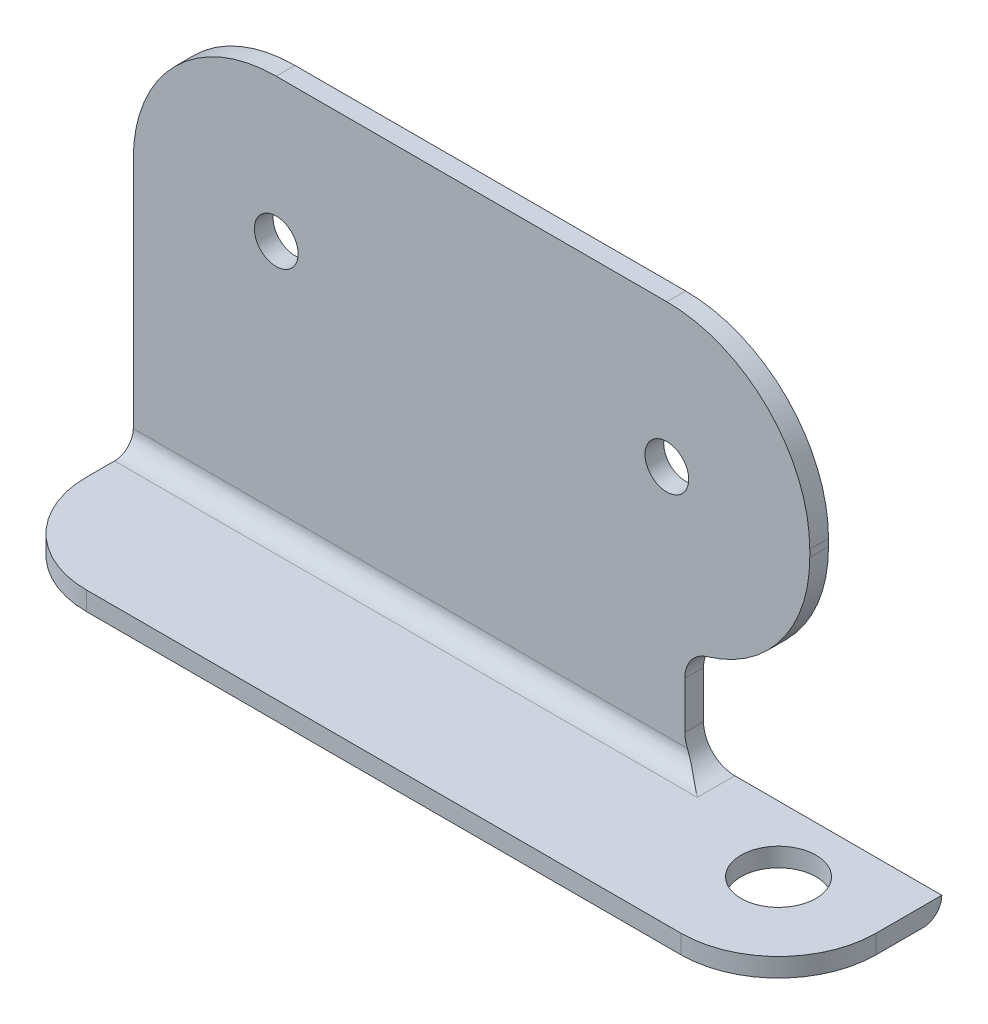
ISO-10303-21;
HEADER;
FILE_DESCRIPTION(('STEP AP214'),'2;1');
FILE_NAME('part.step','',(''),(''),'','','');
FILE_SCHEMA(('AUTOMOTIVE_DESIGN { 1 0 10303 214 1 1 1 1 }'));
ENDSEC;
DATA;
#1=APPLICATION_CONTEXT('core data for automotive mechanical design processes');
#2=APPLICATION_PROTOCOL_DEFINITION('international standard','automotive_design',2000,#1);
#3=PRODUCT_CONTEXT('',#1,'mechanical');
#4=PRODUCT('Part','Part','',(#3));
#5=PRODUCT_RELATED_PRODUCT_CATEGORY('part','',(#4));
#6=PRODUCT_DEFINITION_FORMATION('','',#4);
#7=PRODUCT_DEFINITION_CONTEXT('part definition',#1,'design');
#8=PRODUCT_DEFINITION('design','',#6,#7);
#9=PRODUCT_DEFINITION_SHAPE('','',#8);
#10=(LENGTH_UNIT() NAMED_UNIT(*) SI_UNIT(.MILLI.,.METRE.));
#11=(NAMED_UNIT(*) PLANE_ANGLE_UNIT() SI_UNIT($,.RADIAN.));
#12=(NAMED_UNIT(*) SI_UNIT($,.STERADIAN.) SOLID_ANGLE_UNIT());
#13=UNCERTAINTY_MEASURE_WITH_UNIT(LENGTH_MEASURE(1.E-05),#10,'distance_accuracy_value','');
#14=(GEOMETRIC_REPRESENTATION_CONTEXT(3) GLOBAL_UNCERTAINTY_ASSIGNED_CONTEXT((#13)) GLOBAL_UNIT_ASSIGNED_CONTEXT((#10,
#11,#12)) REPRESENTATION_CONTEXT('',''));
#15=CARTESIAN_POINT('',(0.,0.,0.));
#16=DIRECTION('',(0.,0.,1.));
#17=DIRECTION('',(1.,0.,0.));
#18=AXIS2_PLACEMENT_3D('',#15,#16,#17);
#19=CARTESIAN_POINT('',(0.,0.,1.524));
#20=DIRECTION('',(0.,0.,1.));
#21=DIRECTION('',(1.,0.,0.));
#22=AXIS2_PLACEMENT_3D('',#19,#20,#21);
#23=PLANE('',#22);
#24=CARTESIAN_POINT('',(15.875,0.,1.524));
#25=DIRECTION('',(0.,0.,-1.));
#26=DIRECTION('',(1.,0.,0.));
#27=AXIS2_PLACEMENT_3D('',#24,#25,#26);
#28=CIRCLE('',#27,1.778);
#29=CARTESIAN_POINT('',(14.097,0.,1.524));
#30=VERTEX_POINT('',#29);
#31=EDGE_CURVE('E211',#30,#30,#28,.T.);
#32=ORIENTED_EDGE('',*,*,#31,.T.);
#33=EDGE_LOOP('',(#32));
#34=FACE_BOUND('',#33,.T.);
#35=CARTESIAN_POINT('',(-15.875,0.,1.524));
#36=DIRECTION('',(0.,0.,-1.));
#37=DIRECTION('',(1.,0.,0.));
#38=AXIS2_PLACEMENT_3D('',#35,#36,#37);
#39=CIRCLE('',#38,1.778);
#40=CARTESIAN_POINT('',(-17.653,0.,1.524));
#41=VERTEX_POINT('',#40);
#42=EDGE_CURVE('E205',#41,#41,#39,.T.);
#43=ORIENTED_EDGE('',*,*,#42,.T.);
#44=EDGE_LOOP('',(#43));
#45=FACE_BOUND('',#44,.T.);
#46=CARTESIAN_POINT('',(19.8755,-17.9705,1.524));
#47=DIRECTION('',(0.,0.,-1.));
#48=DIRECTION('',(1.,0.,0.));
#49=AXIS2_PLACEMENT_3D('',#46,#47,#48);
#50=CIRCLE('',#49,2.54);
#51=CARTESIAN_POINT('',(17.5475515469624,-18.9865,1.524));
#52=VERTEX_POINT('',#51);
#53=CARTESIAN_POINT('',(17.3355,-17.9705,1.524));
#54=VERTEX_POINT('',#53);
#55=EDGE_CURVE('E185',#52,#54,#50,.T.);
#56=ORIENTED_EDGE('',*,*,#55,.T.);
#57=DIRECTION('',(0.,1.,0.));
#58=VECTOR('',#57,1.);
#59=CARTESIAN_POINT('',(17.3355,0.,1.524));
#60=LINE('',#59,#58);
#61=CARTESIAN_POINT('',(17.3355,-14.1605,1.524));
#62=VERTEX_POINT('',#61);
#63=EDGE_CURVE('E190',#54,#62,#60,.T.);
#64=ORIENTED_EDGE('',*,*,#63,.T.);
#65=CARTESIAN_POINT('',(19.8755,-14.1605,1.524));
#66=DIRECTION('',(0.,0.,-1.));
#67=DIRECTION('',(1.,0.,0.));
#68=AXIS2_PLACEMENT_3D('',#65,#66,#67);
#69=CIRCLE('',#68,2.54);
#70=CARTESIAN_POINT('',(19.1579215246637,-11.7239694478144,1.524));
#71=VERTEX_POINT('',#70);
#72=EDGE_CURVE('E155',#62,#71,#69,.T.);
#73=ORIENTED_EDGE('',*,*,#72,.T.);
#74=CARTESIAN_POINT('',(15.875,-0.576842171565131,1.524));
#75=DIRECTION('',(0.,0.,-1.));
#76=DIRECTION('',(1.,0.,0.));
#77=AXIS2_PLACEMENT_3D('',#74,#75,#76);
#78=CIRCLE('',#77,11.6205);
#79=CARTESIAN_POINT('',(27.4955,-0.576842171565131,1.524));
#80=VERTEX_POINT('',#79);
#81=EDGE_CURVE('E269',#80,#71,#78,.T.);
#82=ORIENTED_EDGE('',*,*,#81,.F.);
#83=DIRECTION('',(0.,-1.,0.));
#84=VECTOR('',#83,1.);
#85=CARTESIAN_POINT('',(27.4955,-11.6205,1.524));
#86=LINE('',#85,#84);
#87=CARTESIAN_POINT('',(27.4955,0.,1.524));
#88=VERTEX_POINT('',#87);
#89=EDGE_CURVE('E224',#88,#80,#86,.T.);
#90=ORIENTED_EDGE('',*,*,#89,.F.);
#91=CARTESIAN_POINT('',(15.875,0.,1.524));
#92=DIRECTION('',(0.,0.,-1.));
#93=DIRECTION('',(1.,0.,0.));
#94=AXIS2_PLACEMENT_3D('',#91,#92,#93);
#95=CIRCLE('',#94,11.6205);
#96=CARTESIAN_POINT('',(15.875,11.6205,1.524));
#97=VERTEX_POINT('',#96);
#98=EDGE_CURVE('E258',#97,#88,#95,.T.);
#99=ORIENTED_EDGE('',*,*,#98,.F.);
#100=DIRECTION('',(1.,0.,0.));
#101=VECTOR('',#100,1.);
#102=CARTESIAN_POINT('',(-27.4955,11.6205,1.524));
#103=LINE('',#102,#101);
#104=CARTESIAN_POINT('',(-15.875,11.6205,1.524));
#105=VERTEX_POINT('',#104);
#106=EDGE_CURVE('E220',#105,#97,#103,.T.);
#107=ORIENTED_EDGE('',*,*,#106,.F.);
#108=CARTESIAN_POINT('',(-15.875,0.,1.524));
#109=DIRECTION('',(0.,0.,-1.));
#110=DIRECTION('',(1.,0.,0.));
#111=AXIS2_PLACEMENT_3D('',#108,#109,#110);
#112=CIRCLE('',#111,11.6205);
#113=CARTESIAN_POINT('',(-27.4955,0.,1.524));
#114=VERTEX_POINT('',#113);
#115=EDGE_CURVE('E272',#114,#105,#112,.T.);
#116=ORIENTED_EDGE('',*,*,#115,.F.);
#117=DIRECTION('',(0.,1.,0.));
#118=VECTOR('',#117,1.);
#119=CARTESIAN_POINT('',(-27.4955,-22.0345,1.524));
#120=LINE('',#119,#118);
#121=CARTESIAN_POINT('',(-27.4955,-18.9865,1.524));
#122=VERTEX_POINT('',#121);
#123=EDGE_CURVE('E217',#122,#114,#120,.T.);
#124=ORIENTED_EDGE('',*,*,#123,.F.);
#125=DIRECTION('',(1.,0.,0.));
#126=VECTOR('',#125,1.);
#127=CARTESIAN_POINT('',(0.,-18.9865,1.524));
#128=LINE('',#127,#126);
#129=EDGE_CURVE('E282',#52,#122,#128,.F.);
#130=ORIENTED_EDGE('',*,*,#129,.F.);
#131=EDGE_LOOP('',(#56,#64,#73,#82,#90,#99,#107,#116,#124,#130));
#132=FACE_BOUND('',#131,.T.);
#133=ADVANCED_FACE('F35',(#34,#45,#132),#23,.T.);
#134=CARTESIAN_POINT('',(0.,0.,0.));
#135=DIRECTION('',(0.,0.,1.));
#136=DIRECTION('',(1.,0.,0.));
#137=AXIS2_PLACEMENT_3D('',#134,#135,#136);
#138=PLANE('',#137);
#139=DIRECTION('',(0.,1.,0.));
#140=VECTOR('',#139,1.);
#141=CARTESIAN_POINT('',(-27.4955,-7.42949999999999,0.));
#142=LINE('',#141,#140);
#143=CARTESIAN_POINT('',(-27.4955,-20.5105,0.));
#144=VERTEX_POINT('',#143);
#145=CARTESIAN_POINT('',(-27.4955,0.,0.));
#146=VERTEX_POINT('',#145);
#147=EDGE_CURVE('E214',#144,#146,#142,.T.);
#148=ORIENTED_EDGE('',*,*,#147,.T.);
#149=CARTESIAN_POINT('',(-15.875,0.,0.));
#150=DIRECTION('',(0.,0.,-1.));
#151=DIRECTION('',(1.,0.,0.));
#152=AXIS2_PLACEMENT_3D('',#149,#150,#151);
#153=CIRCLE('',#152,11.6205);
#154=CARTESIAN_POINT('',(-15.875,11.6205,0.));
#155=VERTEX_POINT('',#154);
#156=EDGE_CURVE('E264',#155,#146,#153,.F.);
#157=ORIENTED_EDGE('',*,*,#156,.F.);
#158=DIRECTION('',(1.,0.,0.));
#159=VECTOR('',#158,1.);
#160=CARTESIAN_POINT('',(-27.4955,11.6205,0.));
#161=LINE('',#160,#159);
#162=CARTESIAN_POINT('',(15.875,11.6205,0.));
#163=VERTEX_POINT('',#162);
#164=EDGE_CURVE('E229',#155,#163,#161,.T.);
#165=ORIENTED_EDGE('',*,*,#164,.T.);
#166=CARTESIAN_POINT('',(15.875,0.,0.));
#167=DIRECTION('',(0.,0.,-1.));
#168=DIRECTION('',(1.,0.,0.));
#169=AXIS2_PLACEMENT_3D('',#166,#167,#168);
#170=CIRCLE('',#169,11.6205);
#171=CARTESIAN_POINT('',(27.4955,0.,0.));
#172=VERTEX_POINT('',#171);
#173=EDGE_CURVE('E253',#172,#163,#170,.F.);
#174=ORIENTED_EDGE('',*,*,#173,.F.);
#175=DIRECTION('',(0.,-1.,0.));
#176=VECTOR('',#175,1.);
#177=CARTESIAN_POINT('',(27.4955,-11.6205,0.));
#178=LINE('',#177,#176);
#179=CARTESIAN_POINT('',(27.4955,-0.576842171565131,0.));
#180=VERTEX_POINT('',#179);
#181=EDGE_CURVE('E221',#172,#180,#178,.T.);
#182=ORIENTED_EDGE('',*,*,#181,.T.);
#183=CARTESIAN_POINT('',(15.875,-0.576842171565131,0.));
#184=DIRECTION('',(0.,0.,-1.));
#185=DIRECTION('',(1.,0.,0.));
#186=AXIS2_PLACEMENT_3D('',#183,#184,#185);
#187=CIRCLE('',#186,11.6205);
#188=CARTESIAN_POINT('',(19.1579215246637,-11.7239694478144,0.));
#189=VERTEX_POINT('',#188);
#190=EDGE_CURVE('E175',#189,#180,#187,.F.);
#191=ORIENTED_EDGE('',*,*,#190,.F.);
#192=CARTESIAN_POINT('',(19.8755,-14.1605,0.));
#193=DIRECTION('',(0.,0.,1.));
#194=DIRECTION('',(-1.,0.,0.));
#195=AXIS2_PLACEMENT_3D('',#192,#193,#194);
#196=CIRCLE('',#195,2.54);
#197=CARTESIAN_POINT('',(17.3355,-14.1605,0.));
#198=VERTEX_POINT('',#197);
#199=EDGE_CURVE('E152',#189,#198,#196,.T.);
#200=ORIENTED_EDGE('',*,*,#199,.T.);
#201=DIRECTION('',(0.,-1.,0.));
#202=VECTOR('',#201,1.);
#203=CARTESIAN_POINT('',(17.3355,-14.1605,0.));
#204=LINE('',#203,#202);
#205=CARTESIAN_POINT('',(17.3355,-17.9705,0.));
#206=VERTEX_POINT('',#205);
#207=EDGE_CURVE('E163',#198,#206,#204,.T.);
#208=ORIENTED_EDGE('',*,*,#207,.T.);
#209=CARTESIAN_POINT('',(19.8755,-17.9705,0.));
#210=DIRECTION('',(0.,0.,1.));
#211=DIRECTION('',(-1.,0.,0.));
#212=AXIS2_PLACEMENT_3D('',#209,#210,#211);
#213=CIRCLE('',#212,2.54);
#214=CARTESIAN_POINT('',(19.8755,-20.5105,0.));
#215=VERTEX_POINT('',#214);
#216=EDGE_CURVE('E168',#206,#215,#213,.T.);
#217=ORIENTED_EDGE('',*,*,#216,.T.);
#218=DIRECTION('',(-1.,0.,0.));
#219=VECTOR('',#218,1.);
#220=CARTESIAN_POINT('',(0.,-20.5105,0.));
#221=LINE('',#220,#219);
#222=EDGE_CURVE('E368',#144,#215,#221,.F.);
#223=ORIENTED_EDGE('',*,*,#222,.F.);
#224=EDGE_LOOP('',(#148,#157,#165,#174,#182,#191,#200,#208,#217,#223));
#225=FACE_BOUND('',#224,.T.);
#226=CARTESIAN_POINT('',(15.875,0.,0.));
#227=DIRECTION('',(0.,0.,-1.));
#228=DIRECTION('',(1.,0.,0.));
#229=AXIS2_PLACEMENT_3D('',#226,#227,#228);
#230=CIRCLE('',#229,1.778);
#231=CARTESIAN_POINT('',(14.097,0.,0.));
#232=VERTEX_POINT('',#231);
#233=EDGE_CURVE('E208',#232,#232,#230,.T.);
#234=ORIENTED_EDGE('',*,*,#233,.F.);
#235=EDGE_LOOP('',(#234));
#236=FACE_BOUND('',#235,.T.);
#237=CARTESIAN_POINT('',(-15.875,0.,0.));
#238=DIRECTION('',(0.,0.,-1.));
#239=DIRECTION('',(1.,0.,0.));
#240=AXIS2_PLACEMENT_3D('',#237,#238,#239);
#241=CIRCLE('',#240,1.778);
#242=CARTESIAN_POINT('',(-17.653,0.,0.));
#243=VERTEX_POINT('',#242);
#244=EDGE_CURVE('E204',#243,#243,#241,.T.);
#245=ORIENTED_EDGE('',*,*,#244,.F.);
#246=EDGE_LOOP('',(#245));
#247=FACE_BOUND('',#246,.T.);
#248=ADVANCED_FACE('F171',(#225,#236,#247),#138,.F.);
#249=CARTESIAN_POINT('',(36.703,-20.5105,1.524));
#250=DIRECTION('',(-1.,0.,0.));
#251=DIRECTION('',(0.,0.,1.));
#252=AXIS2_PLACEMENT_3D('',#249,#250,#251);
#253=PLANE('',#252);
#254=DIRECTION('',(0.,0.,-1.));
#255=VECTOR('',#254,1.);
#256=CARTESIAN_POINT('',(36.703,-20.5105,1.524));
#257=LINE('',#256,#255);
#258=CARTESIAN_POINT('',(36.703,-20.5105,5.334));
#259=VERTEX_POINT('',#258);
#260=CARTESIAN_POINT('',(36.703,-20.5105,0.));
#261=VERTEX_POINT('',#260);
#262=EDGE_CURVE('E227',#259,#261,#257,.T.);
#263=ORIENTED_EDGE('',*,*,#262,.F.);
#264=DIRECTION('',(0.,-1.,0.));
#265=VECTOR('',#264,1.);
#266=CARTESIAN_POINT('',(36.703,-20.5105,5.334));
#267=LINE('',#266,#265);
#268=CARTESIAN_POINT('',(36.703,-22.0345,5.334));
#269=VERTEX_POINT('',#268);
#270=EDGE_CURVE('E245',#269,#259,#267,.F.);
#271=ORIENTED_EDGE('',*,*,#270,.F.);
#272=DIRECTION('',(0.,0.,-1.));
#273=VECTOR('',#272,1.);
#274=CARTESIAN_POINT('',(36.703,-22.0345,1.524));
#275=LINE('',#274,#273);
#276=CARTESIAN_POINT('',(36.703,-22.0345,1.524));
#277=VERTEX_POINT('',#276);
#278=EDGE_CURVE('E238',#269,#277,#275,.T.);
#279=ORIENTED_EDGE('',*,*,#278,.T.);
#280=CARTESIAN_POINT('',(36.703,-20.5105,1.524));
#281=DIRECTION('',(1.,0.,0.));
#282=DIRECTION('',(0.,0.,1.));
#283=AXIS2_PLACEMENT_3D('',#280,#281,#282);
#284=CIRCLE('',#283,1.524);
#285=EDGE_CURVE('E385',#261,#277,#284,.F.);
#286=ORIENTED_EDGE('',*,*,#285,.F.);
#287=EDGE_LOOP('',(#263,#271,#279,#286));
#288=FACE_BOUND('',#287,.T.);
#289=ADVANCED_FACE('F316',(#288),#253,.F.);
#290=CARTESIAN_POINT('',(36.703,-22.0345,1.524));
#291=DIRECTION('',(0.,1.,0.));
#292=DIRECTION('',(1.,0.,0.));
#293=AXIS2_PLACEMENT_3D('',#290,#291,#292);
#294=PLANE('',#293);
#295=DIRECTION('',(0.,0.,-1.));
#296=VECTOR('',#295,1.);
#297=CARTESIAN_POINT('',(-27.4955,-22.0345,1.524));
#298=LINE('',#297,#296);
#299=CARTESIAN_POINT('',(-27.4955,-22.0345,5.334));
#300=VERTEX_POINT('',#299);
#301=CARTESIAN_POINT('',(-27.4955,-22.0345,1.524));
#302=VERTEX_POINT('',#301);
#303=EDGE_CURVE('E235',#300,#302,#298,.T.);
#304=ORIENTED_EDGE('',*,*,#303,.T.);
#305=DIRECTION('',(-1.,0.,0.));
#306=VECTOR('',#305,1.);
#307=CARTESIAN_POINT('',(36.703,-22.0345,1.524));
#308=LINE('',#307,#306);
#309=EDGE_CURVE('E389',#277,#302,#308,.T.);
#310=ORIENTED_EDGE('',*,*,#309,.F.);
#311=ORIENTED_EDGE('',*,*,#278,.F.);
#312=CARTESIAN_POINT('',(28.7655,-22.0345,5.334));
#313=DIRECTION('',(0.,-1.,0.));
#314=DIRECTION('',(1.,0.,0.));
#315=AXIS2_PLACEMENT_3D('',#312,#313,#314);
#316=CIRCLE('',#315,7.9375);
#317=CARTESIAN_POINT('',(28.7655,-22.0345,13.2715));
#318=VERTEX_POINT('',#317);
#319=EDGE_CURVE('E243',#318,#269,#316,.F.);
#320=ORIENTED_EDGE('',*,*,#319,.F.);
#321=DIRECTION('',(-1.,0.,0.));
#322=VECTOR('',#321,1.);
#323=CARTESIAN_POINT('',(36.703,-22.0345,13.2715));
#324=LINE('',#323,#322);
#325=CARTESIAN_POINT('',(-19.558,-22.0345,13.2715));
#326=VERTEX_POINT('',#325);
#327=EDGE_CURVE('E198',#318,#326,#324,.T.);
#328=ORIENTED_EDGE('',*,*,#327,.T.);
#329=CARTESIAN_POINT('',(-19.558,-22.0345,5.334));
#330=DIRECTION('',(0.,-1.,0.));
#331=DIRECTION('',(1.,0.,0.));
#332=AXIS2_PLACEMENT_3D('',#329,#330,#331);
#333=CIRCLE('',#332,7.9375);
#334=EDGE_CURVE('E393',#300,#326,#333,.F.);
#335=ORIENTED_EDGE('',*,*,#334,.F.);
#336=EDGE_LOOP('',(#304,#310,#311,#320,#328,#335));
#337=FACE_BOUND('',#336,.T.);
#338=CARTESIAN_POINT('',(28.7655,-22.0345,5.334));
#339=DIRECTION('',(0.,-1.,0.));
#340=DIRECTION('',(1.,0.,0.));
#341=AXIS2_PLACEMENT_3D('',#338,#339,#340);
#342=CIRCLE('',#341,3.048);
#343=CARTESIAN_POINT('',(31.8135,-22.0345,5.334));
#344=VERTEX_POINT('',#343);
#345=EDGE_CURVE('E195',#344,#344,#342,.T.);
#346=ORIENTED_EDGE('',*,*,#345,.F.);
#347=EDGE_LOOP('',(#346));
#348=FACE_BOUND('',#347,.T.);
#349=ADVANCED_FACE('F334',(#337,#348),#294,.F.);
#350=CARTESIAN_POINT('',(-27.4955,-7.42949999999999,1.524));
#351=DIRECTION('',(1.,0.,0.));
#352=DIRECTION('',(0.,-1.,0.));
#353=AXIS2_PLACEMENT_3D('',#350,#351,#352);
#354=PLANE('',#353);
#355=DIRECTION('',(0.,0.,-1.));
#356=VECTOR('',#355,1.);
#357=CARTESIAN_POINT('',(-27.4955,-20.5105,58.4457141962647));
#358=LINE('',#357,#356);
#359=CARTESIAN_POINT('',(-27.4955,-20.5105,5.33400000000001));
#360=VERTEX_POINT('',#359);
#361=CARTESIAN_POINT('',(-27.4955,-20.5105,3.04800000000002));
#362=VERTEX_POINT('',#361);
#363=EDGE_CURVE('E176',#360,#362,#358,.T.);
#364=ORIENTED_EDGE('',*,*,#363,.T.);
#365=CARTESIAN_POINT('',(-27.4955,-18.9865,3.048));
#366=DIRECTION('',(-1.,0.,0.));
#367=DIRECTION('',(0.,-1.,0.));
#368=AXIS2_PLACEMENT_3D('',#365,#366,#367);
#369=CIRCLE('',#368,1.524);
#370=EDGE_CURVE('E292',#122,#362,#369,.T.);
#371=ORIENTED_EDGE('',*,*,#370,.F.);
#372=ORIENTED_EDGE('',*,*,#123,.T.);
#373=DIRECTION('',(0.,0.,-1.));
#374=VECTOR('',#373,1.);
#375=CARTESIAN_POINT('',(-27.4955,0.,1.524));
#376=LINE('',#375,#374);
#377=EDGE_CURVE('E267',#146,#114,#376,.F.);
#378=ORIENTED_EDGE('',*,*,#377,.F.);
#379=ORIENTED_EDGE('',*,*,#147,.F.);
#380=CARTESIAN_POINT('',(-27.4955,-20.5105,1.524));
#381=DIRECTION('',(-1.,0.,0.));
#382=DIRECTION('',(0.,-1.,0.));
#383=AXIS2_PLACEMENT_3D('',#380,#381,#382);
#384=CIRCLE('',#383,1.524);
#385=EDGE_CURVE('E370',#302,#144,#384,.F.);
#386=ORIENTED_EDGE('',*,*,#385,.F.);
#387=ORIENTED_EDGE('',*,*,#303,.F.);
#388=DIRECTION('',(0.,-1.,0.));
#389=VECTOR('',#388,1.);
#390=CARTESIAN_POINT('',(-27.4955,-7.42949999999999,5.334));
#391=LINE('',#390,#389);
#392=EDGE_CURVE('E387',#360,#300,#391,.T.);
#393=ORIENTED_EDGE('',*,*,#392,.F.);
#394=EDGE_LOOP('',(#364,#371,#372,#378,#379,#386,#387,#393));
#395=FACE_BOUND('',#394,.T.);
#396=ADVANCED_FACE('F330',(#395),#354,.F.);
#397=CARTESIAN_POINT('',(-27.4955,11.6205,1.524));
#398=DIRECTION('',(0.,-1.,0.));
#399=DIRECTION('',(0.,0.,1.));
#400=AXIS2_PLACEMENT_3D('',#397,#398,#399);
#401=PLANE('',#400);
#402=ORIENTED_EDGE('',*,*,#106,.T.);
#403=DIRECTION('',(0.,0.,-1.));
#404=VECTOR('',#403,1.);
#405=CARTESIAN_POINT('',(15.875,11.6205,1.524));
#406=LINE('',#405,#404);
#407=EDGE_CURVE('E256',#163,#97,#406,.F.);
#408=ORIENTED_EDGE('',*,*,#407,.F.);
#409=ORIENTED_EDGE('',*,*,#164,.F.);
#410=DIRECTION('',(0.,0.,-1.));
#411=VECTOR('',#410,1.);
#412=CARTESIAN_POINT('',(-15.875,11.6205,1.524));
#413=LINE('',#412,#411);
#414=EDGE_CURVE('E261',#105,#155,#413,.T.);
#415=ORIENTED_EDGE('',*,*,#414,.F.);
#416=EDGE_LOOP('',(#402,#408,#409,#415));
#417=FACE_BOUND('',#416,.T.);
#418=ADVANCED_FACE('F326',(#417),#401,.F.);
#419=CARTESIAN_POINT('',(27.4955,-11.6205,1.524));
#420=DIRECTION('',(-1.,0.,0.));
#421=DIRECTION('',(0.,0.,1.));
#422=AXIS2_PLACEMENT_3D('',#419,#420,#421);
#423=PLANE('',#422);
#424=ORIENTED_EDGE('',*,*,#181,.F.);
#425=DIRECTION('',(0.,0.,-1.));
#426=VECTOR('',#425,1.);
#427=CARTESIAN_POINT('',(27.4955,0.,1.524));
#428=LINE('',#427,#426);
#429=EDGE_CURVE('E251',#88,#172,#428,.T.);
#430=ORIENTED_EDGE('',*,*,#429,.F.);
#431=ORIENTED_EDGE('',*,*,#89,.T.);
#432=DIRECTION('',(0.,0.,-1.));
#433=VECTOR('',#432,1.);
#434=CARTESIAN_POINT('',(27.4955,-0.576842171565131,1.524));
#435=LINE('',#434,#433);
#436=EDGE_CURVE('E277',#180,#80,#435,.F.);
#437=ORIENTED_EDGE('',*,*,#436,.F.);
#438=EDGE_LOOP('',(#424,#430,#431,#437));
#439=FACE_BOUND('',#438,.T.);
#440=ADVANCED_FACE('F323',(#439),#423,.F.);
#441=CARTESIAN_POINT('',(15.875,0.,1.524));
#442=DIRECTION('',(0.,0.,-1.));
#443=DIRECTION('',(-1.,0.,0.));
#444=AXIS2_PLACEMENT_3D('',#441,#442,#443);
#445=CYLINDRICAL_SURFACE('',#444,1.778);
#446=CARTESIAN_POINT('',(14.097,0.,1.524));
#447=CARTESIAN_POINT('',(14.097,0.,1.508125));
#448=CARTESIAN_POINT('',(14.097,0.,1.49225));
#449=CARTESIAN_POINT('',(14.097,0.,1.4605));
#450=CARTESIAN_POINT('',(14.097,0.,1.444625));
#451=CARTESIAN_POINT('',(14.097,0.,1.412875));
#452=CARTESIAN_POINT('',(14.097,0.,1.397));
#453=CARTESIAN_POINT('',(14.097,0.,1.36525));
#454=CARTESIAN_POINT('',(14.097,0.,1.349375));
#455=CARTESIAN_POINT('',(14.097,0.,1.317625));
#456=CARTESIAN_POINT('',(14.097,0.,1.30175));
#457=CARTESIAN_POINT('',(14.097,0.,1.27));
#458=CARTESIAN_POINT('',(14.097,0.,1.254125));
#459=CARTESIAN_POINT('',(14.097,0.,1.222375));
#460=CARTESIAN_POINT('',(14.097,0.,1.2065));
#461=CARTESIAN_POINT('',(14.097,0.,1.17475));
#462=CARTESIAN_POINT('',(14.097,0.,1.158875));
#463=CARTESIAN_POINT('',(14.097,0.,1.127125));
#464=CARTESIAN_POINT('',(14.097,0.,1.11125));
#465=CARTESIAN_POINT('',(14.097,0.,1.0795));
#466=CARTESIAN_POINT('',(14.097,0.,1.063625));
#467=CARTESIAN_POINT('',(14.097,0.,1.031875));
#468=CARTESIAN_POINT('',(14.097,0.,1.016));
#469=CARTESIAN_POINT('',(14.097,0.,0.98425));
#470=CARTESIAN_POINT('',(14.097,0.,0.968375));
#471=CARTESIAN_POINT('',(14.097,0.,0.936625));
#472=CARTESIAN_POINT('',(14.097,0.,0.92075));
#473=CARTESIAN_POINT('',(14.097,0.,0.889));
#474=CARTESIAN_POINT('',(14.097,0.,0.873125));
#475=CARTESIAN_POINT('',(14.097,0.,0.841375));
#476=CARTESIAN_POINT('',(14.097,0.,0.8255));
#477=CARTESIAN_POINT('',(14.097,0.,0.79375));
#478=CARTESIAN_POINT('',(14.097,0.,0.777875));
#479=CARTESIAN_POINT('',(14.097,0.,0.746125));
#480=CARTESIAN_POINT('',(14.097,0.,0.73025));
#481=CARTESIAN_POINT('',(14.097,0.,0.6985));
#482=CARTESIAN_POINT('',(14.097,0.,0.682625));
#483=CARTESIAN_POINT('',(14.097,0.,0.650875));
#484=CARTESIAN_POINT('',(14.097,0.,0.635));
#485=CARTESIAN_POINT('',(14.097,0.,0.60325));
#486=CARTESIAN_POINT('',(14.097,0.,0.587375));
#487=CARTESIAN_POINT('',(14.097,0.,0.555625));
#488=CARTESIAN_POINT('',(14.097,0.,0.53975));
#489=CARTESIAN_POINT('',(14.097,0.,0.508));
#490=CARTESIAN_POINT('',(14.097,0.,0.492125));
#491=CARTESIAN_POINT('',(14.097,0.,0.460375));
#492=CARTESIAN_POINT('',(14.097,0.,0.4445));
#493=CARTESIAN_POINT('',(14.097,0.,0.41275));
#494=CARTESIAN_POINT('',(14.097,0.,0.396875));
#495=CARTESIAN_POINT('',(14.097,0.,0.365125));
#496=CARTESIAN_POINT('',(14.097,0.,0.34925));
#497=CARTESIAN_POINT('',(14.097,0.,0.3175));
#498=CARTESIAN_POINT('',(14.097,0.,0.301625));
#499=CARTESIAN_POINT('',(14.097,0.,0.269875));
#500=CARTESIAN_POINT('',(14.097,0.,0.254));
#501=CARTESIAN_POINT('',(14.097,0.,0.22225));
#502=CARTESIAN_POINT('',(14.097,0.,0.206375));
#503=CARTESIAN_POINT('',(14.097,0.,0.174625));
#504=CARTESIAN_POINT('',(14.097,0.,0.15875));
#505=CARTESIAN_POINT('',(14.097,0.,0.127));
#506=CARTESIAN_POINT('',(14.097,0.,0.111125));
#507=CARTESIAN_POINT('',(14.097,0.,0.079375));
#508=CARTESIAN_POINT('',(14.097,0.,0.0635));
#509=CARTESIAN_POINT('',(14.097,0.,0.0317499999999999));
#510=CARTESIAN_POINT('',(14.097,0.,0.015875));
#511=CARTESIAN_POINT('',(14.097,0.,0.));
#512=B_SPLINE_CURVE_WITH_KNOTS('',3,(#446,#447,#448,#449,#450,#451,#452,#453,#454,#455,#456,
#457,#458,#459,#460,#461,#462,#463,#464,#465,#466,#467,#468,#469,#470,#471,#472,#473,#474,#475,
#476,#477,#478,#479,#480,#481,#482,#483,#484,#485,#486,#487,#488,#489,#490,#491,#492,#493,#494,
#495,#496,#497,#498,#499,#500,#501,#502,#503,#504,#505,#506,#507,#508,#509,#510,#511),
.UNSPECIFIED.,.F.,.F.,(4,2,2,2,2,2,2,2,2,2,2,2,2,2,2,2,2,2,2,2,2,2,2,2,2,2,2,2,2,2,2,2,4),(0.,
0.0476250000000001,0.0952500000000001,0.142875,0.1905,0.238125,0.28575,0.333375,0.381,0.428625,
0.47625,0.523875,0.5715,0.619125,0.66675,0.714375,0.762,0.809625,0.85725,0.904875,0.9525,
1.000125,1.04775,1.095375,1.143,1.190625,1.23825,1.285875,1.3335,1.381125,1.42875,1.476375,
1.524),.UNSPECIFIED.);
#513=EDGE_CURVE('BSEAM320',#30,#232,#512,.T.);
#514=ORIENTED_EDGE('',*,*,#31,.F.);
#515=ORIENTED_EDGE('',*,*,#233,.T.);
#516=ORIENTED_EDGE('',*,*,#513,.T.);
#517=ORIENTED_EDGE('',*,*,#513,.F.);
#518=EDGE_LOOP('',(#514,#516,#515,#517));
#519=FACE_BOUND('',#518,.T.);
#520=ADVANCED_FACE('F320',(#519),#445,.F.);
#521=CARTESIAN_POINT('',(-15.875,0.,1.524));
#522=DIRECTION('',(0.,0.,-1.));
#523=DIRECTION('',(-1.,0.,0.));
#524=AXIS2_PLACEMENT_3D('',#521,#522,#523);
#525=CYLINDRICAL_SURFACE('',#524,1.778);
#526=CARTESIAN_POINT('',(-17.653,0.,1.524));
#527=CARTESIAN_POINT('',(-17.653,0.,1.508125));
#528=CARTESIAN_POINT('',(-17.653,0.,1.49225));
#529=CARTESIAN_POINT('',(-17.653,0.,1.4605));
#530=CARTESIAN_POINT('',(-17.653,0.,1.444625));
#531=CARTESIAN_POINT('',(-17.653,0.,1.412875));
#532=CARTESIAN_POINT('',(-17.653,0.,1.397));
#533=CARTESIAN_POINT('',(-17.653,0.,1.36525));
#534=CARTESIAN_POINT('',(-17.653,0.,1.349375));
#535=CARTESIAN_POINT('',(-17.653,0.,1.317625));
#536=CARTESIAN_POINT('',(-17.653,0.,1.30175));
#537=CARTESIAN_POINT('',(-17.653,0.,1.27));
#538=CARTESIAN_POINT('',(-17.653,0.,1.254125));
#539=CARTESIAN_POINT('',(-17.653,0.,1.222375));
#540=CARTESIAN_POINT('',(-17.653,0.,1.2065));
#541=CARTESIAN_POINT('',(-17.653,0.,1.17475));
#542=CARTESIAN_POINT('',(-17.653,0.,1.158875));
#543=CARTESIAN_POINT('',(-17.653,0.,1.127125));
#544=CARTESIAN_POINT('',(-17.653,0.,1.11125));
#545=CARTESIAN_POINT('',(-17.653,0.,1.0795));
#546=CARTESIAN_POINT('',(-17.653,0.,1.063625));
#547=CARTESIAN_POINT('',(-17.653,0.,1.031875));
#548=CARTESIAN_POINT('',(-17.653,0.,1.016));
#549=CARTESIAN_POINT('',(-17.653,0.,0.98425));
#550=CARTESIAN_POINT('',(-17.653,0.,0.968375));
#551=CARTESIAN_POINT('',(-17.653,0.,0.936625));
#552=CARTESIAN_POINT('',(-17.653,0.,0.92075));
#553=CARTESIAN_POINT('',(-17.653,0.,0.889));
#554=CARTESIAN_POINT('',(-17.653,0.,0.873125));
#555=CARTESIAN_POINT('',(-17.653,0.,0.841375));
#556=CARTESIAN_POINT('',(-17.653,0.,0.8255));
#557=CARTESIAN_POINT('',(-17.653,0.,0.79375));
#558=CARTESIAN_POINT('',(-17.653,0.,0.777875));
#559=CARTESIAN_POINT('',(-17.653,0.,0.746125));
#560=CARTESIAN_POINT('',(-17.653,0.,0.73025));
#561=CARTESIAN_POINT('',(-17.653,0.,0.6985));
#562=CARTESIAN_POINT('',(-17.653,0.,0.682625));
#563=CARTESIAN_POINT('',(-17.653,0.,0.650875));
#564=CARTESIAN_POINT('',(-17.653,0.,0.635));
#565=CARTESIAN_POINT('',(-17.653,0.,0.60325));
#566=CARTESIAN_POINT('',(-17.653,0.,0.587375));
#567=CARTESIAN_POINT('',(-17.653,0.,0.555625));
#568=CARTESIAN_POINT('',(-17.653,0.,0.53975));
#569=CARTESIAN_POINT('',(-17.653,0.,0.508));
#570=CARTESIAN_POINT('',(-17.653,0.,0.492125));
#571=CARTESIAN_POINT('',(-17.653,0.,0.460375));
#572=CARTESIAN_POINT('',(-17.653,0.,0.4445));
#573=CARTESIAN_POINT('',(-17.653,0.,0.41275));
#574=CARTESIAN_POINT('',(-17.653,0.,0.396875));
#575=CARTESIAN_POINT('',(-17.653,0.,0.365125));
#576=CARTESIAN_POINT('',(-17.653,0.,0.34925));
#577=CARTESIAN_POINT('',(-17.653,0.,0.3175));
#578=CARTESIAN_POINT('',(-17.653,0.,0.301625));
#579=CARTESIAN_POINT('',(-17.653,0.,0.269875));
#580=CARTESIAN_POINT('',(-17.653,0.,0.254));
#581=CARTESIAN_POINT('',(-17.653,0.,0.22225));
#582=CARTESIAN_POINT('',(-17.653,0.,0.206375));
#583=CARTESIAN_POINT('',(-17.653,0.,0.174625));
#584=CARTESIAN_POINT('',(-17.653,0.,0.15875));
#585=CARTESIAN_POINT('',(-17.653,0.,0.127));
#586=CARTESIAN_POINT('',(-17.653,0.,0.111125));
#587=CARTESIAN_POINT('',(-17.653,0.,0.079375));
#588=CARTESIAN_POINT('',(-17.653,0.,0.0635));
#589=CARTESIAN_POINT('',(-17.653,0.,0.0317499999999999));
#590=CARTESIAN_POINT('',(-17.653,0.,0.015875));
#591=CARTESIAN_POINT('',(-17.653,0.,0.));
#592=B_SPLINE_CURVE_WITH_KNOTS('',3,(#526,#527,#528,#529,#530,#531,#532,#533,#534,#535,#536,
#537,#538,#539,#540,#541,#542,#543,#544,#545,#546,#547,#548,#549,#550,#551,#552,#553,#554,#555,
#556,#557,#558,#559,#560,#561,#562,#563,#564,#565,#566,#567,#568,#569,#570,#571,#572,#573,#574,
#575,#576,#577,#578,#579,#580,#581,#582,#583,#584,#585,#586,#587,#588,#589,#590,#591),
.UNSPECIFIED.,.F.,.F.,(4,2,2,2,2,2,2,2,2,2,2,2,2,2,2,2,2,2,2,2,2,2,2,2,2,2,2,2,2,2,2,2,4),(0.,
0.0476250000000001,0.0952500000000001,0.142875,0.1905,0.238125,0.28575,0.333375,0.381,0.428625,
0.47625,0.523875,0.5715,0.619125,0.66675,0.714375,0.762,0.809625,0.85725,0.904875,0.9525,
1.000125,1.04775,1.095375,1.143,1.190625,1.23825,1.285875,1.3335,1.381125,1.42875,1.476375,
1.524),.UNSPECIFIED.);
#593=EDGE_CURVE('BSEAM411',#41,#243,#592,.T.);
#594=ORIENTED_EDGE('',*,*,#42,.F.);
#595=ORIENTED_EDGE('',*,*,#244,.T.);
#596=ORIENTED_EDGE('',*,*,#593,.T.);
#597=ORIENTED_EDGE('',*,*,#593,.F.);
#598=EDGE_LOOP('',(#594,#596,#595,#597));
#599=FACE_BOUND('',#598,.T.);
#600=ADVANCED_FACE('F411',(#599),#525,.F.);
#601=CARTESIAN_POINT('',(36.703,-20.5105,13.2715));
#602=DIRECTION('',(0.,-1.,0.));
#603=DIRECTION('',(-1.,0.,0.));
#604=AXIS2_PLACEMENT_3D('',#601,#602,#603);
#605=PLANE('',#604);
#606=CARTESIAN_POINT('',(28.7655,-20.5105,5.334));
#607=DIRECTION('',(0.,-1.,0.));
#608=DIRECTION('',(1.,0.,0.));
#609=AXIS2_PLACEMENT_3D('',#606,#607,#608);
#610=CIRCLE('',#609,3.048);
#611=CARTESIAN_POINT('',(31.8135,-20.5105,5.334));
#612=VERTEX_POINT('',#611);
#613=EDGE_CURVE('E192',#612,#612,#610,.T.);
#614=ORIENTED_EDGE('',*,*,#613,.T.);
#615=EDGE_LOOP('',(#614));
#616=FACE_BOUND('',#615,.T.);
#617=DIRECTION('',(1.,0.,0.));
#618=VECTOR('',#617,1.);
#619=CARTESIAN_POINT('',(36.703,-20.5105,13.2715));
#620=LINE('',#619,#618);
#621=CARTESIAN_POINT('',(-19.558,-20.5105,13.2715));
#622=VERTEX_POINT('',#621);
#623=CARTESIAN_POINT('',(28.7655,-20.5105,13.2715));
#624=VERTEX_POINT('',#623);
#625=EDGE_CURVE('E201',#622,#624,#620,.T.);
#626=ORIENTED_EDGE('',*,*,#625,.T.);
#627=CARTESIAN_POINT('',(28.7655,-20.5105,5.334));
#628=DIRECTION('',(0.,1.,0.));
#629=DIRECTION('',(-1.,0.,0.));
#630=AXIS2_PLACEMENT_3D('',#627,#628,#629);
#631=CIRCLE('',#630,7.9375);
#632=EDGE_CURVE('E248',#259,#624,#631,.F.);
#633=ORIENTED_EDGE('',*,*,#632,.F.);
#634=ORIENTED_EDGE('',*,*,#262,.T.);
#635=DIRECTION('',(1.,0.,0.));
#636=VECTOR('',#635,1.);
#637=CARTESIAN_POINT('',(19.8755,-20.5105,0.));
#638=LINE('',#637,#636);
#639=EDGE_CURVE('E160',#215,#261,#638,.T.);
#640=ORIENTED_EDGE('',*,*,#639,.F.);
#641=DIRECTION('',(0.,0.,-1.));
#642=VECTOR('',#641,1.);
#643=CARTESIAN_POINT('',(19.8755,-20.5105,13.9446));
#644=LINE('',#643,#642);
#645=CARTESIAN_POINT('',(19.8755,-20.5105,3.048));
#646=VERTEX_POINT('',#645);
#647=EDGE_CURVE('E183',#646,#215,#644,.T.);
#648=ORIENTED_EDGE('',*,*,#647,.F.);
#649=DIRECTION('',(1.,0.,0.));
#650=VECTOR('',#649,1.);
#651=CARTESIAN_POINT('',(36.703,-20.5105,3.048));
#652=LINE('',#651,#650);
#653=EDGE_CURVE('E279',#362,#646,#652,.T.);
#654=ORIENTED_EDGE('',*,*,#653,.F.);
#655=ORIENTED_EDGE('',*,*,#363,.F.);
#656=CARTESIAN_POINT('',(-19.558,-20.5105,5.334));
#657=DIRECTION('',(0.,1.,0.));
#658=DIRECTION('',(-1.,0.,0.));
#659=AXIS2_PLACEMENT_3D('',#656,#657,#658);
#660=CIRCLE('',#659,7.9375);
#661=EDGE_CURVE('E11',#622,#360,#660,.F.);
#662=ORIENTED_EDGE('',*,*,#661,.F.);
#663=EDGE_LOOP('',(#626,#633,#634,#640,#648,#654,#655,#662));
#664=FACE_BOUND('',#663,.T.);
#665=ADVANCED_FACE('F381',(#616,#664),#605,.F.);
#666=CARTESIAN_POINT('',(0.,0.,13.2715));
#667=DIRECTION('',(0.,0.,-1.));
#668=DIRECTION('',(-1.,0.,0.));
#669=AXIS2_PLACEMENT_3D('',#666,#667,#668);
#670=PLANE('',#669);
#671=ORIENTED_EDGE('',*,*,#327,.F.);
#672=DIRECTION('',(0.,-1.,0.));
#673=VECTOR('',#672,1.);
#674=CARTESIAN_POINT('',(28.7655,0.,13.2715));
#675=LINE('',#674,#673);
#676=EDGE_CURVE('E241',#624,#318,#675,.T.);
#677=ORIENTED_EDGE('',*,*,#676,.F.);
#678=ORIENTED_EDGE('',*,*,#625,.F.);
#679=DIRECTION('',(0.,-1.,0.));
#680=VECTOR('',#679,1.);
#681=CARTESIAN_POINT('',(-19.558,0.,13.2715));
#682=LINE('',#681,#680);
#683=EDGE_CURVE('E43',#326,#622,#682,.F.);
#684=ORIENTED_EDGE('',*,*,#683,.F.);
#685=EDGE_LOOP('',(#671,#677,#678,#684));
#686=FACE_BOUND('',#685,.T.);
#687=ADVANCED_FACE('F399',(#686),#670,.F.);
#688=CARTESIAN_POINT('',(28.7655,-34.4551,5.334));
#689=DIRECTION('',(0.,1.,0.));
#690=DIRECTION('',(1.,0.,0.));
#691=AXIS2_PLACEMENT_3D('',#688,#689,#690);
#692=CYLINDRICAL_SURFACE('',#691,3.048);
#693=ORIENTED_EDGE('',*,*,#613,.F.);
#694=EDGE_LOOP('',(#693));
#695=FACE_BOUND('',#694,.T.);
#696=ORIENTED_EDGE('',*,*,#345,.T.);
#697=EDGE_LOOP('',(#696));
#698=FACE_BOUND('',#697,.T.);
#699=ADVANCED_FACE('F403',(#695,#698),#692,.F.);
#700=CARTESIAN_POINT('',(19.8755,-17.9705,13.9446));
#701=DIRECTION('',(0.,0.,-1.));
#702=DIRECTION('',(-1.,0.,0.));
#703=AXIS2_PLACEMENT_3D('',#700,#701,#702);
#704=CYLINDRICAL_SURFACE('',#703,2.54);
#705=ORIENTED_EDGE('',*,*,#647,.T.);
#706=ORIENTED_EDGE('',*,*,#216,.F.);
#707=DIRECTION('',(0.,0.,-1.));
#708=VECTOR('',#707,1.);
#709=CARTESIAN_POINT('',(17.3355,-17.9705,13.9446));
#710=LINE('',#709,#708);
#711=EDGE_CURVE('E159',#54,#206,#710,.T.);
#712=ORIENTED_EDGE('',*,*,#711,.F.);
#713=ORIENTED_EDGE('',*,*,#55,.F.);
#714=CARTESIAN_POINT('',(17.5475515469624,-18.9865,1.524));
#715=CARTESIAN_POINT('',(17.5672472654258,-19.0316560186973,1.52399513726266));
#716=CARTESIAN_POINT('',(17.5882635824378,-19.0762009042753,1.52600611045439));
#717=CARTESIAN_POINT('',(17.6326650253971,-19.1636799619868,1.53370032251843));
#718=CARTESIAN_POINT('',(17.6560462214487,-19.206616648986,1.53937755078635));
#719=CARTESIAN_POINT('',(17.7047216867703,-19.2902124424946,1.55397241371087));
#720=CARTESIAN_POINT('',(17.7299940300148,-19.3308903015169,1.56285643351122));
#721=CARTESIAN_POINT('',(17.7824234208108,-19.4102557621123,1.58352399332433));
#722=CARTESIAN_POINT('',(17.8095814324554,-19.4489423277247,1.59530902450307));
#723=CARTESIAN_POINT('',(17.908166900425,-19.5814487964071,1.64133837352595));
#724=CARTESIAN_POINT('',(17.9841019026707,-19.6696309719166,1.68248005272117));
#725=CARTESIAN_POINT('',(18.143637241959,-19.8320405497228,1.77657704561547));
#726=CARTESIAN_POINT('',(18.2272735150868,-19.9061970297805,1.82958958669633));
#727=CARTESIAN_POINT('',(18.4340914753251,-20.0674746395878,1.96666022709575));
#728=CARTESIAN_POINT('',(18.5597695039215,-20.1480185412213,2.05467936445942));
#729=CARTESIAN_POINT('',(18.8170816067228,-20.2840634114614,2.24042642209682));
#730=CARTESIAN_POINT('',(18.9487198772019,-20.3395464246954,2.33816124239021));
#731=CARTESIAN_POINT('',(19.2110376093122,-20.4258051755872,2.53591831848904));
#732=CARTESIAN_POINT('',(19.3416113727465,-20.457319196621,2.63576548761217));
#733=CARTESIAN_POINT('',(19.6040114748552,-20.4994327681697,2.83771680637285));
#734=CARTESIAN_POINT('',(19.7358347343988,-20.5100746256235,2.93981596538622));
#735=CARTESIAN_POINT('',(19.8701875931688,-20.5104958275255,3.04388502819377));
#736=CARTESIAN_POINT('',(19.8728438259765,-20.5104999937549,3.04594253731352));
#737=CARTESIAN_POINT('',(19.8755,-20.5105,3.048));
#738=B_SPLINE_CURVE_WITH_KNOTS('',3,(#714,#715,#716,#717,#718,#719,#720,#721,#722,#723,#724,
#725,#726,#727,#728,#729,#730,#731,#732,#733,#734,#735,#736,#737),.UNSPECIFIED.,.F.,.F.,(4,2,2,
2,2,2,2,2,2,2,2,4),(0.,0.147683787486705,0.295126068856728,0.441065666746934,0.587080437128706,
0.955175378640923,1.32508457997396,1.84214113393,2.35956755800387,2.86032707039096,
3.36007051242266,3.37015020270813),.UNSPECIFIED.);
#739=EDGE_CURVE('E285',#646,#52,#738,.F.);
#740=ORIENTED_EDGE('',*,*,#739,.F.);
#741=EDGE_LOOP('',(#705,#706,#712,#713,#740));
#742=FACE_BOUND('',#741,.T.);
#743=ADVANCED_FACE('F294',(#742),#704,.F.);
#744=CARTESIAN_POINT('',(17.3355,-14.1605,13.9446));
#745=DIRECTION('',(-1.,0.,0.));
#746=DIRECTION('',(0.,0.,1.));
#747=AXIS2_PLACEMENT_3D('',#744,#745,#746);
#748=PLANE('',#747);
#749=ORIENTED_EDGE('',*,*,#63,.F.);
#750=ORIENTED_EDGE('',*,*,#711,.T.);
#751=ORIENTED_EDGE('',*,*,#207,.F.);
#752=DIRECTION('',(0.,0.,-1.));
#753=VECTOR('',#752,1.);
#754=CARTESIAN_POINT('',(17.3355,-14.1605,13.9446));
#755=LINE('',#754,#753);
#756=EDGE_CURVE('E148',#62,#198,#755,.T.);
#757=ORIENTED_EDGE('',*,*,#756,.F.);
#758=EDGE_LOOP('',(#749,#750,#751,#757));
#759=FACE_BOUND('',#758,.T.);
#760=ADVANCED_FACE('F164',(#759),#748,.F.);
#761=CARTESIAN_POINT('',(19.8755,-14.1605,13.9446));
#762=DIRECTION('',(0.,0.,-1.));
#763=DIRECTION('',(-1.,0.,0.));
#764=AXIS2_PLACEMENT_3D('',#761,#762,#763);
#765=CYLINDRICAL_SURFACE('',#764,2.54);
#766=ORIENTED_EDGE('',*,*,#72,.F.);
#767=ORIENTED_EDGE('',*,*,#756,.T.);
#768=ORIENTED_EDGE('',*,*,#199,.F.);
#769=DIRECTION('',(0.,0.,-1.));
#770=VECTOR('',#769,1.);
#771=CARTESIAN_POINT('',(19.1579215246637,-11.7239694478144,13.9446));
#772=LINE('',#771,#770);
#773=EDGE_CURVE('E275',#71,#189,#772,.T.);
#774=ORIENTED_EDGE('',*,*,#773,.F.);
#775=EDGE_LOOP('',(#766,#767,#768,#774));
#776=FACE_BOUND('',#775,.T.);
#777=ADVANCED_FACE('F150',(#776),#765,.F.);
#778=CARTESIAN_POINT('',(28.7655,0.,5.334));
#779=DIRECTION('',(0.,-1.,0.));
#780=DIRECTION('',(0.,0.,1.));
#781=AXIS2_PLACEMENT_3D('',#778,#779,#780);
#782=CYLINDRICAL_SURFACE('',#781,7.9375);
#783=ORIENTED_EDGE('',*,*,#632,.T.);
#784=ORIENTED_EDGE('',*,*,#676,.T.);
#785=ORIENTED_EDGE('',*,*,#319,.T.);
#786=ORIENTED_EDGE('',*,*,#270,.T.);
#787=EDGE_LOOP('',(#783,#784,#785,#786));
#788=FACE_BOUND('',#787,.T.);
#789=ADVANCED_FACE('F342',(#788),#782,.T.);
#790=CARTESIAN_POINT('',(15.875,0.,1.524));
#791=DIRECTION('',(0.,0.,-1.));
#792=DIRECTION('',(-1.,0.,0.));
#793=AXIS2_PLACEMENT_3D('',#790,#791,#792);
#794=CYLINDRICAL_SURFACE('',#793,11.6205);
#795=ORIENTED_EDGE('',*,*,#98,.T.);
#796=ORIENTED_EDGE('',*,*,#429,.T.);
#797=ORIENTED_EDGE('',*,*,#173,.T.);
#798=ORIENTED_EDGE('',*,*,#407,.T.);
#799=EDGE_LOOP('',(#795,#796,#797,#798));
#800=FACE_BOUND('',#799,.T.);
#801=ADVANCED_FACE('F345',(#800),#794,.T.);
#802=CARTESIAN_POINT('',(-15.875,0.,1.524));
#803=DIRECTION('',(0.,0.,-1.));
#804=DIRECTION('',(-1.,0.,0.));
#805=AXIS2_PLACEMENT_3D('',#802,#803,#804);
#806=CYLINDRICAL_SURFACE('',#805,11.6205);
#807=ORIENTED_EDGE('',*,*,#115,.T.);
#808=ORIENTED_EDGE('',*,*,#414,.T.);
#809=ORIENTED_EDGE('',*,*,#156,.T.);
#810=ORIENTED_EDGE('',*,*,#377,.T.);
#811=EDGE_LOOP('',(#807,#808,#809,#810));
#812=FACE_BOUND('',#811,.T.);
#813=ADVANCED_FACE('F348',(#812),#806,.T.);
#814=CARTESIAN_POINT('',(15.875,-0.576842171565131,13.9446));
#815=DIRECTION('',(0.,0.,-1.));
#816=DIRECTION('',(-1.,0.,0.));
#817=AXIS2_PLACEMENT_3D('',#814,#815,#816);
#818=CYLINDRICAL_SURFACE('',#817,11.6205);
#819=ORIENTED_EDGE('',*,*,#81,.T.);
#820=ORIENTED_EDGE('',*,*,#773,.T.);
#821=ORIENTED_EDGE('',*,*,#190,.T.);
#822=ORIENTED_EDGE('',*,*,#436,.T.);
#823=EDGE_LOOP('',(#819,#820,#821,#822));
#824=FACE_BOUND('',#823,.T.);
#825=ADVANCED_FACE('F302',(#824),#818,.T.);
#826=CARTESIAN_POINT('',(36.703,-18.9865,3.048));
#827=DIRECTION('',(1.,0.,0.));
#828=DIRECTION('',(0.,-1.,0.));
#829=AXIS2_PLACEMENT_3D('',#826,#827,#828);
#830=CYLINDRICAL_SURFACE('',#829,1.524);
#831=ORIENTED_EDGE('',*,*,#370,.T.);
#832=ORIENTED_EDGE('',*,*,#653,.T.);
#833=ORIENTED_EDGE('',*,*,#739,.T.);
#834=ORIENTED_EDGE('',*,*,#129,.T.);
#835=EDGE_LOOP('',(#831,#832,#833,#834));
#836=FACE_BOUND('',#835,.T.);
#837=ADVANCED_FACE('F297',(#836),#830,.F.);
#838=CARTESIAN_POINT('',(36.703,-20.5105,1.524));
#839=DIRECTION('',(-1.,0.,0.));
#840=DIRECTION('',(0.,1.,0.));
#841=AXIS2_PLACEMENT_3D('',#838,#839,#840);
#842=CYLINDRICAL_SURFACE('',#841,1.524);
#843=ORIENTED_EDGE('',*,*,#639,.T.);
#844=ORIENTED_EDGE('',*,*,#285,.T.);
#845=ORIENTED_EDGE('',*,*,#309,.T.);
#846=ORIENTED_EDGE('',*,*,#385,.T.);
#847=ORIENTED_EDGE('',*,*,#222,.T.);
#848=EDGE_LOOP('',(#843,#844,#845,#846,#847));
#849=FACE_BOUND('',#848,.T.);
#850=ADVANCED_FACE('F301',(#849),#842,.T.);
#851=CARTESIAN_POINT('',(-19.558,-7.42949999999999,5.334));
#852=DIRECTION('',(0.,-1.,0.));
#853=DIRECTION('',(-1.,0.,0.));
#854=AXIS2_PLACEMENT_3D('',#851,#852,#853);
#855=CYLINDRICAL_SURFACE('',#854,7.9375);
#856=ORIENTED_EDGE('',*,*,#661,.T.);
#857=ORIENTED_EDGE('',*,*,#392,.T.);
#858=ORIENTED_EDGE('',*,*,#334,.T.);
#859=ORIENTED_EDGE('',*,*,#683,.T.);
#860=EDGE_LOOP('',(#856,#857,#858,#859));
#861=FACE_BOUND('',#860,.T.);
#862=ADVANCED_FACE('F37',(#861),#855,.T.);
#863=CLOSED_SHELL('',(#133,#248,#289,#349,#396,#418,#440,#520,#600,#665,#687,#699,#743,#760,
#777,#789,#801,#813,#825,#837,#850,#862));
#864=MANIFOLD_SOLID_BREP('B2',#863);
#865=ADVANCED_BREP_SHAPE_REPRESENTATION('',(#18,#864),#14);
#866=SHAPE_DEFINITION_REPRESENTATION(#9,#865);
ENDSEC;
END-ISO-10303-21;
